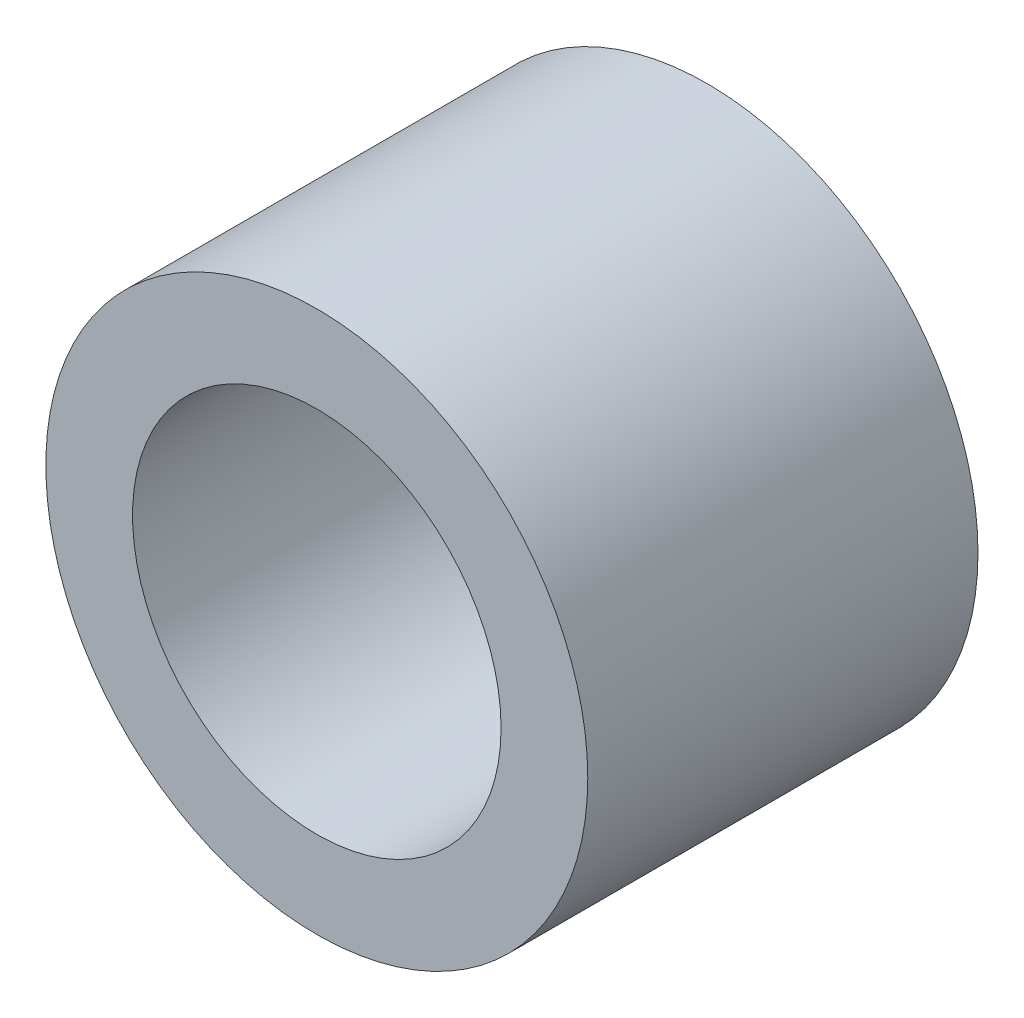
ISO-10303-21;
HEADER;
FILE_DESCRIPTION(('STEP AP214'),'2;1');
FILE_NAME('part.step','',(''),(''),'','','');
FILE_SCHEMA(('AUTOMOTIVE_DESIGN { 1 0 10303 214 1 1 1 1 }'));
ENDSEC;
DATA;
#1=APPLICATION_CONTEXT('core data for automotive mechanical design processes');
#2=APPLICATION_PROTOCOL_DEFINITION('international standard','automotive_design',2000,#1);
#3=PRODUCT_CONTEXT('',#1,'mechanical');
#4=PRODUCT('Part','Part','',(#3));
#5=PRODUCT_RELATED_PRODUCT_CATEGORY('part','',(#4));
#6=PRODUCT_DEFINITION_FORMATION('','',#4);
#7=PRODUCT_DEFINITION_CONTEXT('part definition',#1,'design');
#8=PRODUCT_DEFINITION('design','',#6,#7);
#9=PRODUCT_DEFINITION_SHAPE('','',#8);
#10=(LENGTH_UNIT() NAMED_UNIT(*) SI_UNIT(.MILLI.,.METRE.));
#11=(NAMED_UNIT(*) PLANE_ANGLE_UNIT() SI_UNIT($,.RADIAN.));
#12=(NAMED_UNIT(*) SI_UNIT($,.STERADIAN.) SOLID_ANGLE_UNIT());
#13=UNCERTAINTY_MEASURE_WITH_UNIT(LENGTH_MEASURE(1.E-05),#10,'distance_accuracy_value','');
#14=(GEOMETRIC_REPRESENTATION_CONTEXT(3) GLOBAL_UNCERTAINTY_ASSIGNED_CONTEXT((#13)) GLOBAL_UNIT_ASSIGNED_CONTEXT((#10,
#11,#12)) REPRESENTATION_CONTEXT('',''));
#15=CARTESIAN_POINT('',(0.,0.,0.));
#16=DIRECTION('',(0.,0.,1.));
#17=DIRECTION('',(1.,0.,0.));
#18=AXIS2_PLACEMENT_3D('',#15,#16,#17);
#19=CARTESIAN_POINT('',(0.,0.,6.858));
#20=DIRECTION('',(0.,0.,1.));
#21=DIRECTION('',(1.,0.,0.));
#22=AXIS2_PLACEMENT_3D('',#19,#20,#21);
#23=PLANE('',#22);
#24=CARTESIAN_POINT('',(0.,0.,6.858));
#25=DIRECTION('',(0.,0.,1.));
#26=DIRECTION('',(1.,0.,0.));
#27=AXIS2_PLACEMENT_3D('',#24,#25,#26);
#28=CIRCLE('',#27,4.7625);
#29=CARTESIAN_POINT('',(4.7625,0.,6.858));
#30=VERTEX_POINT('',#29);
#31=EDGE_CURVE('E10',#30,#30,#28,.T.);
#32=ORIENTED_EDGE('',*,*,#31,.T.);
#33=EDGE_LOOP('',(#32));
#34=FACE_BOUND('',#33,.T.);
#35=CARTESIAN_POINT('',(0.,0.,6.858));
#36=DIRECTION('',(0.,0.,1.));
#37=DIRECTION('',(1.,0.,0.));
#38=AXIS2_PLACEMENT_3D('',#35,#36,#37);
#39=CIRCLE('',#38,3.2385);
#40=CARTESIAN_POINT('',(3.2385,0.,6.858));
#41=VERTEX_POINT('',#40);
#42=EDGE_CURVE('E54',#41,#41,#39,.T.);
#43=ORIENTED_EDGE('',*,*,#42,.F.);
#44=EDGE_LOOP('',(#43));
#45=FACE_BOUND('',#44,.T.);
#46=ADVANCED_FACE('F43',(#34,#45),#23,.T.);
#47=CARTESIAN_POINT('',(0.,0.,0.));
#48=DIRECTION('',(0.,0.,1.));
#49=DIRECTION('',(1.,0.,0.));
#50=AXIS2_PLACEMENT_3D('',#47,#48,#49);
#51=PLANE('',#50);
#52=CARTESIAN_POINT('',(0.,0.,0.));
#53=DIRECTION('',(0.,0.,1.));
#54=DIRECTION('',(1.,0.,0.));
#55=AXIS2_PLACEMENT_3D('',#52,#53,#54);
#56=CIRCLE('',#55,4.7625);
#57=CARTESIAN_POINT('',(4.7625,0.,0.));
#58=VERTEX_POINT('',#57);
#59=EDGE_CURVE('E47',#58,#58,#56,.T.);
#60=ORIENTED_EDGE('',*,*,#59,.F.);
#61=EDGE_LOOP('',(#60));
#62=FACE_BOUND('',#61,.T.);
#63=CARTESIAN_POINT('',(0.,0.,0.));
#64=DIRECTION('',(0.,0.,1.));
#65=DIRECTION('',(1.,0.,0.));
#66=AXIS2_PLACEMENT_3D('',#63,#64,#65);
#67=CIRCLE('',#66,3.2385);
#68=CARTESIAN_POINT('',(3.2385,0.,0.));
#69=VERTEX_POINT('',#68);
#70=EDGE_CURVE('E56',#69,#69,#67,.T.);
#71=ORIENTED_EDGE('',*,*,#70,.T.);
#72=EDGE_LOOP('',(#71));
#73=FACE_BOUND('',#72,.T.);
#74=ADVANCED_FACE('F66',(#62,#73),#51,.F.);
#75=CARTESIAN_POINT('',(0.,0.,6.858));
#76=DIRECTION('',(0.,0.,-1.));
#77=DIRECTION('',(-1.,0.,0.));
#78=AXIS2_PLACEMENT_3D('',#75,#76,#77);
#79=CYLINDRICAL_SURFACE('',#78,4.7625);
#80=ORIENTED_EDGE('',*,*,#31,.F.);
#81=EDGE_LOOP('',(#80));
#82=FACE_BOUND('',#81,.T.);
#83=ORIENTED_EDGE('',*,*,#59,.T.);
#84=EDGE_LOOP('',(#83));
#85=FACE_BOUND('',#84,.T.);
#86=ADVANCED_FACE('F45',(#82,#85),#79,.T.);
#87=CARTESIAN_POINT('',(0.,0.,6.858));
#88=DIRECTION('',(0.,0.,-1.));
#89=DIRECTION('',(-1.,0.,0.));
#90=AXIS2_PLACEMENT_3D('',#87,#88,#89);
#91=CYLINDRICAL_SURFACE('',#90,3.2385);
#92=ORIENTED_EDGE('',*,*,#42,.T.);
#93=EDGE_LOOP('',(#92));
#94=FACE_BOUND('',#93,.T.);
#95=ORIENTED_EDGE('',*,*,#70,.F.);
#96=EDGE_LOOP('',(#95));
#97=FACE_BOUND('',#96,.T.);
#98=ADVANCED_FACE('F62',(#94,#97),#91,.F.);
#99=CLOSED_SHELL('',(#46,#74,#86,#98));
#100=MANIFOLD_SOLID_BREP('B2',#99);
#101=ADVANCED_BREP_SHAPE_REPRESENTATION('',(#18,#100),#14);
#102=SHAPE_DEFINITION_REPRESENTATION(#9,#101);
ENDSEC;
END-ISO-10303-21;
